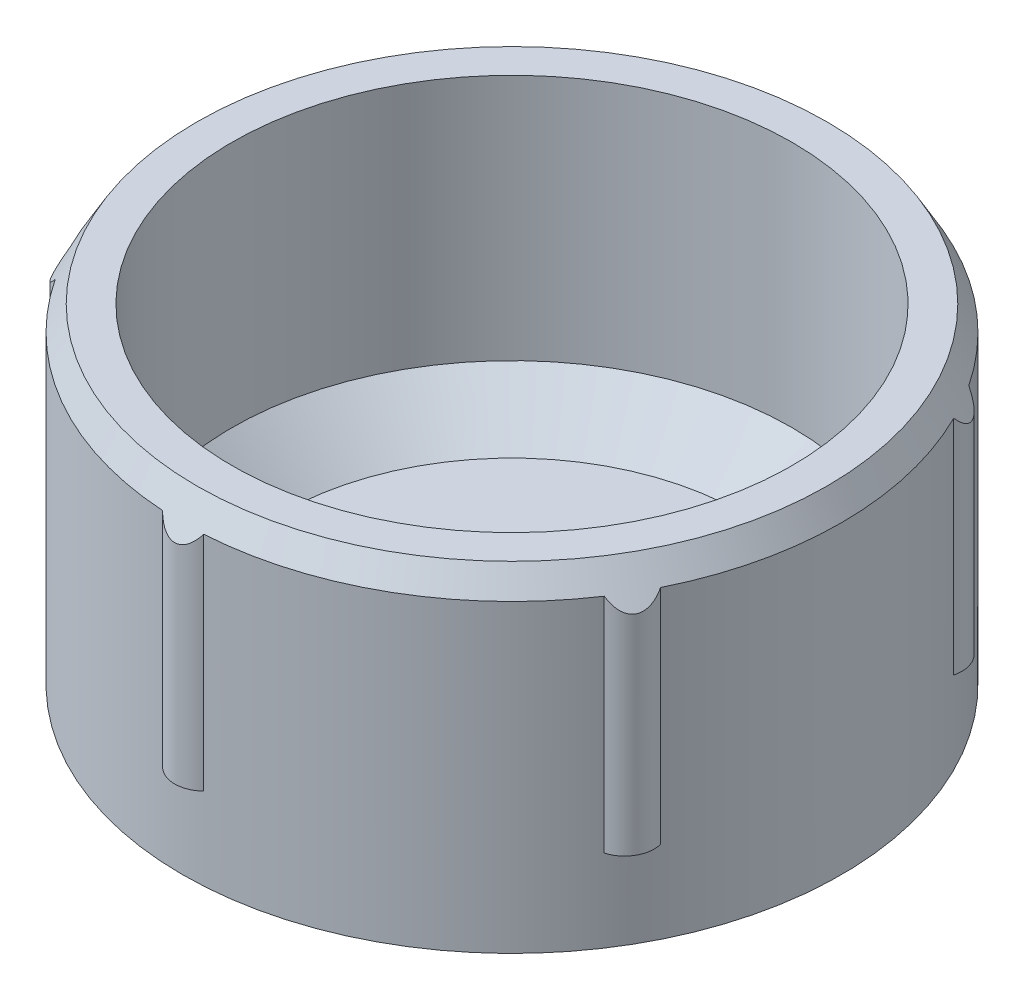
ISO-10303-21;
HEADER;
FILE_DESCRIPTION(('STEP AP214'),'2;1');
FILE_NAME('part.step','',(''),(''),'','','');
FILE_SCHEMA(('AUTOMOTIVE_DESIGN { 1 0 10303 214 1 1 1 1 }'));
ENDSEC;
DATA;
#1=APPLICATION_CONTEXT('core data for automotive mechanical design processes');
#2=APPLICATION_PROTOCOL_DEFINITION('international standard','automotive_design',2000,#1);
#3=PRODUCT_CONTEXT('',#1,'mechanical');
#4=PRODUCT('Part','Part','',(#3));
#5=PRODUCT_RELATED_PRODUCT_CATEGORY('part','',(#4));
#6=PRODUCT_DEFINITION_FORMATION('','',#4);
#7=PRODUCT_DEFINITION_CONTEXT('part definition',#1,'design');
#8=PRODUCT_DEFINITION('design','',#6,#7);
#9=PRODUCT_DEFINITION_SHAPE('','',#8);
#10=(LENGTH_UNIT() NAMED_UNIT(*) SI_UNIT(.MILLI.,.METRE.));
#11=(NAMED_UNIT(*) PLANE_ANGLE_UNIT() SI_UNIT($,.RADIAN.));
#12=(NAMED_UNIT(*) SI_UNIT($,.STERADIAN.) SOLID_ANGLE_UNIT());
#13=UNCERTAINTY_MEASURE_WITH_UNIT(LENGTH_MEASURE(1.E-05),#10,'distance_accuracy_value','');
#14=(GEOMETRIC_REPRESENTATION_CONTEXT(3) GLOBAL_UNCERTAINTY_ASSIGNED_CONTEXT((#13)) GLOBAL_UNIT_ASSIGNED_CONTEXT((#10,
#11,#12)) REPRESENTATION_CONTEXT('',''));
#15=CARTESIAN_POINT('',(0.,0.,0.));
#16=DIRECTION('',(0.,0.,1.));
#17=DIRECTION('',(1.,0.,0.));
#18=AXIS2_PLACEMENT_3D('',#15,#16,#17);
#19=CARTESIAN_POINT('',(-20.,20.,0.));
#20=DIRECTION('',(0.,-1.,0.));
#21=DIRECTION('',(0.,0.,-1.));
#22=AXIS2_PLACEMENT_3D('',#19,#20,#21);
#23=PLANE('',#22);
#24=CARTESIAN_POINT('',(0.,20.,0.));
#25=DIRECTION('',(0.,-1.,0.));
#26=DIRECTION('',(0.,0.,-1.));
#27=AXIS2_PLACEMENT_3D('',#24,#25,#26);
#28=CIRCLE('',#27,17.);
#29=CARTESIAN_POINT('',(0.,20.,-17.));
#30=VERTEX_POINT('',#29);
#31=EDGE_CURVE('E220',#30,#30,#28,.T.);
#32=ORIENTED_EDGE('',*,*,#31,.T.);
#33=EDGE_LOOP('',(#32));
#34=FACE_BOUND('',#33,.T.);
#35=CARTESIAN_POINT('',(0.,20.,0.));
#36=DIRECTION('',(0.,-1.,0.));
#37=DIRECTION('',(0.,0.,-1.));
#38=AXIS2_PLACEMENT_3D('',#35,#36,#37);
#39=CIRCLE('',#38,19.1339745962156);
#40=CARTESIAN_POINT('',(0.,20.,-19.1339745962156));
#41=VERTEX_POINT('',#40);
#42=EDGE_CURVE('E341',#41,#41,#39,.F.);
#43=ORIENTED_EDGE('',*,*,#42,.T.);
#44=EDGE_LOOP('',(#43));
#45=FACE_BOUND('',#44,.T.);
#46=ADVANCED_FACE('F45',(#34,#45),#23,.F.);
#47=CARTESIAN_POINT('',(0.,0.,0.));
#48=DIRECTION('',(0.,-1.,0.));
#49=DIRECTION('',(0.,0.,-1.));
#50=AXIS2_PLACEMENT_3D('',#47,#48,#49);
#51=CYLINDRICAL_SURFACE('',#50,17.);
#52=CARTESIAN_POINT('',(0.,5.00000000000002,0.));
#53=DIRECTION('',(0.,-1.,0.));
#54=DIRECTION('',(0.,0.,-1.));
#55=AXIS2_PLACEMENT_3D('',#52,#53,#54);
#56=CIRCLE('',#55,17.);
#57=CARTESIAN_POINT('',(0.,5.00000000000002,-17.));
#58=VERTEX_POINT('',#57);
#59=EDGE_CURVE('E54',#58,#58,#56,.T.);
#60=ORIENTED_EDGE('',*,*,#59,.T.);
#61=EDGE_LOOP('',(#60));
#62=FACE_BOUND('',#61,.T.);
#63=ORIENTED_EDGE('',*,*,#31,.F.);
#64=EDGE_LOOP('',(#63));
#65=FACE_BOUND('',#64,.T.);
#66=ADVANCED_FACE('F301',(#62,#65),#51,.F.);
#67=CARTESIAN_POINT('',(-17.,2.,0.));
#68=DIRECTION('',(0.,-1.,0.));
#69=DIRECTION('',(0.,0.,-1.));
#70=AXIS2_PLACEMENT_3D('',#67,#68,#69);
#71=PLANE('',#70);
#72=CARTESIAN_POINT('',(0.,2.,0.));
#73=DIRECTION('',(0.,-1.,0.));
#74=DIRECTION('',(0.,0.,-1.));
#75=AXIS2_PLACEMENT_3D('',#72,#73,#74);
#76=CIRCLE('',#75,14.);
#77=CARTESIAN_POINT('',(0.,2.,-14.));
#78=VERTEX_POINT('',#77);
#79=EDGE_CURVE('E12',#78,#78,#76,.F.);
#80=ORIENTED_EDGE('',*,*,#79,.T.);
#81=EDGE_LOOP('',(#80));
#82=FACE_BOUND('',#81,.T.);
#83=CARTESIAN_POINT('',(0.,2.,-9.5));
#84=DIRECTION('',(0.,1.,0.));
#85=DIRECTION('',(0.,0.,1.));
#86=AXIS2_PLACEMENT_3D('',#83,#84,#85);
#87=CIRCLE('',#86,1.7);
#88=CARTESIAN_POINT('',(0.,2.,-7.8));
#89=VERTEX_POINT('',#88);
#90=EDGE_CURVE('E338',#89,#89,#87,.T.);
#91=ORIENTED_EDGE('',*,*,#90,.F.);
#92=EDGE_LOOP('',(#91));
#93=FACE_BOUND('',#92,.T.);
#94=CARTESIAN_POINT('',(8.22724133595217,2.,4.75));
#95=DIRECTION('',(0.,1.,0.));
#96=DIRECTION('',(0.,0.,1.));
#97=AXIS2_PLACEMENT_3D('',#94,#95,#96);
#98=CIRCLE('',#97,1.7);
#99=CARTESIAN_POINT('',(8.22724133595217,2.,6.45));
#100=VERTEX_POINT('',#99);
#101=EDGE_CURVE('E335',#100,#100,#98,.T.);
#102=ORIENTED_EDGE('',*,*,#101,.F.);
#103=EDGE_LOOP('',(#102));
#104=FACE_BOUND('',#103,.T.);
#105=CARTESIAN_POINT('',(-8.22724133595217,2.,4.75));
#106=DIRECTION('',(0.,1.,0.));
#107=DIRECTION('',(0.,0.,1.));
#108=AXIS2_PLACEMENT_3D('',#105,#106,#107);
#109=CIRCLE('',#108,1.7);
#110=CARTESIAN_POINT('',(-8.22724133595217,2.,6.45));
#111=VERTEX_POINT('',#110);
#112=EDGE_CURVE('E330',#111,#111,#109,.T.);
#113=ORIENTED_EDGE('',*,*,#112,.F.);
#114=EDGE_LOOP('',(#113));
#115=FACE_BOUND('',#114,.T.);
#116=ADVANCED_FACE('F236',(#82,#93,#104,#115),#71,.F.);
#117=CARTESIAN_POINT('',(0.,16.7679491924311,0.));
#118=DIRECTION('',(0.,-1.,0.));
#119=DIRECTION('',(0.,0.,-1.));
#120=AXIS2_PLACEMENT_3D('',#117,#118,#119);
#121=CONICAL_SURFACE('',#120,21.,0.523598775598293);
#122=CARTESIAN_POINT('',(16.6614458574241,18.5002348111229,11.0630375226654));
#123=CARTESIAN_POINT('',(16.7001782902731,18.454769229216,11.0521555921859));
#124=CARTESIAN_POINT('',(16.7393539041802,18.4099928476587,11.0397672479723));
#125=CARTESIAN_POINT('',(16.8186275102973,18.3221202125627,11.0115132694681));
#126=CARTESIAN_POINT('',(16.8587281250766,18.2790300069745,10.9956362676855));
#127=CARTESIAN_POINT('',(16.9403083805225,18.1944350039381,10.9597082746973));
#128=CARTESIAN_POINT('',(16.9817998696506,18.1529688953181,10.9395917710724));
#129=CARTESIAN_POINT('',(17.0652394878581,18.0731452168106,10.894853543078));
#130=CARTESIAN_POINT('',(17.1071868862958,18.0347833239633,10.8702382451638));
#131=CARTESIAN_POINT('',(17.1974656232053,17.9566234286536,10.8118943802732));
#132=CARTESIAN_POINT('',(17.2458262537599,17.9174477506873,10.7773572290143));
#133=CARTESIAN_POINT('',(17.3416663210368,17.8462913000364,10.7008934434424));
#134=CARTESIAN_POINT('',(17.3891488324718,17.8142775544708,10.6590023277315));
#135=CARTESIAN_POINT('',(17.4742722412989,17.7640774609883,10.5749008046223));
#136=CARTESIAN_POINT('',(17.5122450385211,17.7444815847015,10.5338817569699));
#137=CARTESIAN_POINT('',(17.5854352327699,17.7132180100607,10.4466220683779));
#138=CARTESIAN_POINT('',(17.6206534186666,17.7015480344641,10.4003829317131));
#139=CARTESIAN_POINT('',(17.6871163115658,17.687193344434,10.3034241911654));
#140=CARTESIAN_POINT('',(17.7183390033882,17.6845565094118,10.2526821704549));
#141=CARTESIAN_POINT('',(17.7754006544998,17.6886882098856,10.1486208259367));
#142=CARTESIAN_POINT('',(17.801239019765,17.695457782509,10.0953012185562));
#143=CARTESIAN_POINT('',(17.8450096059357,17.7167450165492,9.99256973009802));
#144=CARTESIAN_POINT('',(17.8634277420316,17.7305537217444,9.9432117729305));
#145=CARTESIAN_POINT('',(17.8953549945965,17.7644293771837,9.84512407230255));
#146=CARTESIAN_POINT('',(17.9088648499678,17.784495384595,9.79639423534984));
#147=CARTESIAN_POINT('',(17.9373943623133,17.8419260028524,9.67456206443534));
#148=CARTESIAN_POINT('',(17.9493401542779,17.8827971995671,9.60239980736992));
#149=CARTESIAN_POINT('',(17.9644728385606,17.973312539132,9.46244287158882));
#150=CARTESIAN_POINT('',(17.9676064776809,18.0230080992201,9.39467715482793));
#151=CARTESIAN_POINT('',(17.9669560945629,18.1078779237976,9.2895988555075));
#152=CARTESIAN_POINT('',(17.965390110056,18.1411742332864,9.2507006143139));
#153=CARTESIAN_POINT('',(17.9599512546544,18.2096254343978,9.17470613252085));
#154=CARTESIAN_POINT('',(17.9560771798964,18.2447812872031,9.13761084324119));
#155=CARTESIAN_POINT('',(17.9463921152956,18.3160152245178,9.06576628192951));
#156=CARTESIAN_POINT('',(17.9406129394329,18.3520697205201,9.03098906499385));
#157=CARTESIAN_POINT('',(17.9273360024852,18.4253338561432,8.96312229184458));
#158=CARTESIAN_POINT('',(17.9198407409291,18.4625417483187,8.9300303658215));
#159=CARTESIAN_POINT('',(17.9115947905768,18.5002333299883,8.89771788443911));
#160=B_SPLINE_CURVE_WITH_KNOTS('',3,(#122,#123,#124,#125,#126,#127,#128,#129,#130,#131,#132,
#133,#134,#135,#136,#137,#138,#139,#140,#141,#142,#143,#144,#145,#146,#147,#148,#149,#150,#151,
#152,#153,#154,#155,#156,#157,#158,#159),.UNSPECIFIED.,.F.,.F.,(4,2,2,2,2,2,2,2,2,2,2,2,2,2,2,2,
2,2,4),(0.,0.182160826179334,0.364924250054394,0.550751600339854,0.736315545058584,
0.949241525994604,1.16116606185159,1.33815016579757,1.51508339773941,1.69295301062626,
1.87084223653647,2.03358172624303,2.19629670665743,2.44624938078674,2.69770934459204,
2.8512810410397,3.00493290827438,3.15613890465875,3.30712605058543),.UNSPECIFIED.);
#161=CARTESIAN_POINT('',(16.6616458574241,18.5,11.0629813939002));
#162=VERTEX_POINT('',#161);
#163=CARTESIAN_POINT('',(17.9116458574241,18.5,8.8979178844391));
#164=VERTEX_POINT('',#163);
#165=EDGE_CURVE('E273',#162,#164,#160,.T.);
#166=ORIENTED_EDGE('',*,*,#165,.T.);
#167=CARTESIAN_POINT('',(0.,18.5,0.));
#168=DIRECTION('',(0.,-1.,0.));
#169=DIRECTION('',(0.,0.,-1.));
#170=AXIS2_PLACEMENT_3D('',#167,#168,#169);
#171=CIRCLE('',#170,20.);
#172=CARTESIAN_POINT('',(17.9116458574242,18.5,-8.89791788443901));
#173=VERTEX_POINT('',#172);
#174=EDGE_CURVE('E337',#173,#164,#171,.T.);
#175=ORIENTED_EDGE('',*,*,#174,.F.);
#176=CARTESIAN_POINT('',(17.9115947905768,18.5002333299884,-8.89771788443898));
#177=CARTESIAN_POINT('',(17.9215369382315,18.4547678391037,-8.93670208056534));
#178=CARTESIAN_POINT('',(17.9303960857123,18.4099915479995,-8.97682328660478));
#179=CARTESIAN_POINT('',(17.9455641530924,18.3221190922524,-9.05960313945746));
#180=CARTESIAN_POINT('',(17.9518645397796,18.2790289755355,-9.10226974118383));
#181=CARTESIAN_POINT('',(17.9615400510436,18.1944341486869,-9.1908842018123));
#182=CARTESIAN_POINT('',(17.9648643645706,18.1529681273014,-9.23687507783729));
#183=CARTESIAN_POINT('',(17.9678396847745,18.0731446173148,-9.33150489346812));
#184=CARTESIAN_POINT('',(17.9674958915751,18.0347828057755,-9.38013998711683));
#185=CARTESIAN_POINT('',(17.9621079576199,17.9566230090261,-9.48749553437851));
#186=CARTESIAN_POINT('',(17.9563782011281,17.9174473551226,-9.54664565202623));
#187=CARTESIAN_POINT('',(17.9380786082124,17.8462909588691,-9.66787748955297));
#188=CARTESIAN_POINT('',(17.9255410691993,17.8142772435798,-9.7299441129099));
#189=CARTESIAN_POINT('',(17.8952686757006,17.7640772185813,-9.84571389650055));
#190=CARTESIAN_POINT('',(17.8787315208049,17.744481377586,-9.89910881101481));
#191=CARTESIAN_POINT('',(17.8397574823324,17.7132178725593,-10.0061231845051));
#192=CARTESIAN_POINT('',(17.8173222959234,17.7015479312941,-10.0597425745272));
#193=CARTESIAN_POINT('',(17.7665849917125,17.6871933060141,-10.1657804481601));
#194=CARTESIAN_POINT('',(17.7382524529301,17.6845565011998,-10.2181910744833));
#195=CARTESIAN_POINT('',(17.6766635063937,17.6886882539813,-10.3196385272597));
#196=CARTESIAN_POINT('',(17.6434065560341,17.6954578487292,-10.3686749810502));
#197=CARTESIAN_POINT('',(17.5763237660562,17.7167451202085,-10.4579471249911));
#198=CARTESIAN_POINT('',(17.542787581768,17.7305538444998,-10.4985766663178));
#199=CARTESIAN_POINT('',(17.4738047550894,17.7644295353627,-10.5752703053616));
#200=CARTESIAN_POINT('',(17.4383584011846,17.7844955590972,-10.6113350897368));
#201=CARTESIAN_POINT('',(17.3471133687854,17.8419262301731,-10.6969584495605));
#202=CARTESIAN_POINT('',(17.290591888578,17.8827974667128,-10.7433849367561));
#203=CARTESIAN_POINT('',(17.1769519148707,17.9733128871584,-10.8264686865918));
#204=CARTESIAN_POINT('',(17.1198318765786,18.0230084883751,-10.8630653495138));
#205=CARTESIAN_POINT('',(17.0285061114149,18.1078784329183,-10.9150412700724));
#206=CARTESIAN_POINT('',(16.9940361824178,18.1411748250251,-10.9331342299036));
#207=CARTESIAN_POINT('',(16.9255034619851,18.2096261968349,-10.9664213166428));
#208=CARTESIAN_POINT('',(16.8914408924877,18.2447821377294,-10.9816139252997));
#209=CARTESIAN_POINT('',(16.8243790115477,18.3160162523836,-11.0091487068337));
#210=CARTESIAN_POINT('',(16.7913714060362,18.352070837528,-11.0215324041037));
#211=CARTESIAN_POINT('',(16.7259584625717,18.4253351536821,-11.0439676224043));
#212=CARTESIAN_POINT('',(16.69355232206,18.4625431372344,-11.0540224930217));
#213=CARTESIAN_POINT('',(16.6614458574242,18.5002348111228,-11.0630375226654));
#214=B_SPLINE_CURVE_WITH_KNOTS('',3,(#176,#177,#178,#179,#180,#181,#182,#183,#184,#185,#186,
#187,#188,#189,#190,#191,#192,#193,#194,#195,#196,#197,#198,#199,#200,#201,#202,#203,#204,#205,
#206,#207,#208,#209,#210,#211,#212,#213),.UNSPECIFIED.,.F.,.F.,(4,2,2,2,2,2,2,2,2,2,2,2,2,2,2,2,
2,2,4),(0.,0.182160524739235,0.36492364450876,0.550750683730292,0.736314318658646,
0.949240282739379,1.16116480094071,1.33814883925254,1.51508200577265,1.69295154921639,
1.87084070615777,2.03358019995798,2.19629518434281,2.44624797234064,2.69770805272534,
2.8512800772718,3.00493227327748,3.15613858813752,3.30712605103992),.UNSPECIFIED.);
#215=CARTESIAN_POINT('',(16.6616458574242,18.5,-11.0629813939001));
#216=VERTEX_POINT('',#215);
#217=EDGE_CURVE('E266',#173,#216,#214,.T.);
#218=ORIENTED_EDGE('',*,*,#217,.T.);
#219=CARTESIAN_POINT('',(1.25,18.5,-19.9608992783391));
#220=VERTEX_POINT('',#219);
#221=EDGE_CURVE('E343',#220,#216,#171,.T.);
#222=ORIENTED_EDGE('',*,*,#221,.F.);
#223=CARTESIAN_POINT('',(1.34507792075579,18.6626642267774,-19.8605895145626));
#224=CARTESIAN_POINT('',(1.33027853426855,18.6352353622782,-19.8774642370637));
#225=CARTESIAN_POINT('',(1.31500725599319,18.6080061690719,-19.8942362186015));
#226=CARTESIAN_POINT('',(1.28340451521587,18.5538774667483,-19.927615908715));
#227=CARTESIAN_POINT('',(1.26706900537684,18.5269797418752,-19.9442226755753));
#228=CARTESIAN_POINT('',(1.19200942495374,18.4083380418107,-20.0175569758705));
#229=CARTESIAN_POINT('',(1.12751795452013,18.3192288886964,-20.0728646637481));
#230=CARTESIAN_POINT('',(0.983517024098527,18.150321550876,-20.1780699743248));
#231=CARTESIAN_POINT('',(0.904042137091805,18.0705026022988,-20.2279796433537));
#232=CARTESIAN_POINT('',(0.764745901448866,17.9567142448068,-20.2993320125398));
#233=CARTESIAN_POINT('',(0.7107633817028,17.9176014764809,-20.3239055825861));
#234=CARTESIAN_POINT('',(0.596654255344969,17.8464203083943,-20.3686890951268));
#235=CARTESIAN_POINT('',(0.536536168199431,17.8143423304353,-20.388904970179));
#236=CARTESIAN_POINT('',(0.421018076372237,17.7640849440087,-20.4206093298109));
#237=CARTESIAN_POINT('',(0.366491591178701,17.7444822909253,-20.432989506728));
#238=CARTESIAN_POINT('',(0.254324932728231,17.7132193547174,-20.4527438388516));
#239=CARTESIAN_POINT('',(0.196687540982936,17.7015520993581,-20.4601223885909));
#240=CARTESIAN_POINT('',(0.0795025849839504,17.6871956501368,-20.4692026808169));
#241=CARTESIAN_POINT('',(0.0199461433278847,17.6845570125144,-20.4708724566689));
#242=CARTESIAN_POINT('',(-0.0987073414366853,17.6886855494232,-20.4682606253861));
#243=CARTESIAN_POINT('',(-0.157804332315976,17.6954537780255,-20.4639783513041));
#244=CARTESIAN_POINT('',(-0.268644833279347,17.7167359601958,-20.4505222405503));
#245=CARTESIAN_POINT('',(-0.320585201839165,17.730538661487,-20.4417976308337));
#246=CARTESIAN_POINT('',(-0.42149735948814,17.7644084268064,-20.4204072924908));
#247=CARTESIAN_POINT('',(-0.470467910483586,17.7844780823292,-20.407739933476));
#248=CARTESIAN_POINT('',(-0.590389347522138,17.8419765255881,-20.3714883833622));
#249=CARTESIAN_POINT('',(-0.658977104303013,17.8829335075329,-20.3456986943396));
#250=CARTESIAN_POINT('',(-0.787708573989731,17.9734698023212,-20.2888125863862));
#251=CARTESIAN_POINT('',(-0.847831838855653,18.0230693684797,-20.2577037055653));
#252=CARTESIAN_POINT('',(-0.97218347798527,18.1394433164189,-20.1848898418315));
#253=CARTESIAN_POINT('',(-1.03457390254747,18.2076284619756,-20.1423373788771));
#254=CARTESIAN_POINT('',(-1.14949148271107,18.3499663731441,-20.0537932611772));
#255=CARTESIAN_POINT('',(-1.20199466577378,18.4241330357291,-20.0077936161527));
#256=CARTESIAN_POINT('',(-1.30411528665673,18.5855229380768,-19.9080364577936));
#257=CARTESIAN_POINT('',(-1.35265425743753,18.6732521384137,-19.8540054204845));
#258=CARTESIAN_POINT('',(-1.44058719723802,18.8522863693535,-19.7441799142003));
#259=CARTESIAN_POINT('',(-1.47996561788658,18.9435971765807,-19.6883826270402));
#260=CARTESIAN_POINT('',(-1.55011808943216,19.1272266057055,-19.5766346528821));
#261=CARTESIAN_POINT('',(-1.5810143113918,19.2195085653668,-19.5206993097619));
#262=CARTESIAN_POINT('',(-1.63567000614187,19.4054535268103,-19.4084584726615));
#263=CARTESIAN_POINT('',(-1.65945572755047,19.499110075889,-19.3521551442298));
#264=CARTESIAN_POINT('',(-1.68013914428985,19.5933194700031,-19.2957624881127));
#265=B_SPLINE_CURVE_WITH_KNOTS('',3,(#223,#224,#225,#226,#227,#228,#229,#230,#231,#232,#233,
#234,#235,#236,#237,#238,#239,#240,#241,#242,#243,#244,#245,#246,#247,#248,#249,#250,#251,#252,
#253,#254,#255,#256,#257,#258,#259,#260,#261,#262,#263,#264),.UNSPECIFIED.,.F.,.F.,(4,2,2,2,2,2,
2,2,2,2,2,2,2,2,2,2,2,2,2,2,4),(0.,0.106307515690647,0.213046039788342,0.581380872222424,
0.94887598031696,1.16144777734746,1.3737283257646,1.55076881053815,1.72765354156005,
1.90552714166168,2.08342067470621,2.24611399493321,2.40887468096892,2.65927643579346,
2.91027308202988,3.21455199656416,3.51955942364507,3.86069517402337,4.20240578322097,
4.53890011871915,4.87413648482067),.UNSPECIFIED.);
#266=CARTESIAN_POINT('',(-1.25,18.5,-19.9608992783391));
#267=VERTEX_POINT('',#266);
#268=EDGE_CURVE('E252',#220,#267,#265,.T.);
#269=ORIENTED_EDGE('',*,*,#268,.T.);
#270=CARTESIAN_POINT('',(-16.661645857424,18.5,-11.0629813939003));
#271=VERTEX_POINT('',#270);
#272=EDGE_CURVE('E61',#271,#267,#171,.T.);
#273=ORIENTED_EDGE('',*,*,#272,.F.);
#274=CARTESIAN_POINT('',(-16.661445857424,18.5002348111229,-11.0630375226655));
#275=CARTESIAN_POINT('',(-16.700178290273,18.454769229216,-11.052155592186));
#276=CARTESIAN_POINT('',(-16.7393539041801,18.4099928476588,-11.0397672479723));
#277=CARTESIAN_POINT('',(-16.8186275102973,18.3221202125628,-11.0115132694681));
#278=CARTESIAN_POINT('',(-16.8587281250765,18.2790300069745,-10.9956362676855));
#279=CARTESIAN_POINT('',(-16.9403083805225,18.1944350039381,-10.9597082746974));
#280=CARTESIAN_POINT('',(-16.9817998696506,18.1529688953181,-10.9395917710724));
#281=CARTESIAN_POINT('',(-17.065239487858,18.0731452168107,-10.894853543078));
#282=CARTESIAN_POINT('',(-17.1071868862957,18.0347833239633,-10.8702382451638));
#283=CARTESIAN_POINT('',(-17.1974656232053,17.9566234286536,-10.8118943802733));
#284=CARTESIAN_POINT('',(-17.2458262537598,17.9174477506873,-10.7773572290143));
#285=CARTESIAN_POINT('',(-17.3416663210368,17.8462913000364,-10.7008934434424));
#286=CARTESIAN_POINT('',(-17.3891488324718,17.8142775544708,-10.6590023277315));
#287=CARTESIAN_POINT('',(-17.4742722412988,17.7640774609883,-10.5749008046223));
#288=CARTESIAN_POINT('',(-17.512245038521,17.7444815847015,-10.5338817569699));
#289=CARTESIAN_POINT('',(-17.5854352327699,17.7132180100607,-10.4466220683779));
#290=CARTESIAN_POINT('',(-17.6206534186666,17.7015480344641,-10.4003829317132));
#291=CARTESIAN_POINT('',(-17.6871163115658,17.687193344434,-10.3034241911654));
#292=CARTESIAN_POINT('',(-17.7183390033882,17.6845565094118,-10.2526821704549));
#293=CARTESIAN_POINT('',(-17.7754006544998,17.6886882098856,-10.1486208259367));
#294=CARTESIAN_POINT('',(-17.801239019765,17.695457782509,-10.0953012185562));
#295=CARTESIAN_POINT('',(-17.8450096059357,17.7167450165492,-9.99256973009804));
#296=CARTESIAN_POINT('',(-17.8634277420316,17.7305537217444,-9.94321177293052));
#297=CARTESIAN_POINT('',(-17.8953549945964,17.7644293771837,-9.84512407230257));
#298=CARTESIAN_POINT('',(-17.9088648499678,17.784495384595,-9.79639423534987));
#299=CARTESIAN_POINT('',(-17.9373943623133,17.8419260028524,-9.67456206443536));
#300=CARTESIAN_POINT('',(-17.9493401542779,17.8827971995671,-9.60239980736995));
#301=CARTESIAN_POINT('',(-17.9644728385606,17.973312539132,-9.46244287158885));
#302=CARTESIAN_POINT('',(-17.9676064776809,18.0230080992201,-9.39467715482796));
#303=CARTESIAN_POINT('',(-17.9669560945629,18.1078779237976,-9.28959885550754));
#304=CARTESIAN_POINT('',(-17.965390110056,18.1411742332864,-9.25070061431395));
#305=CARTESIAN_POINT('',(-17.9599512546544,18.2096254343978,-9.17470613252091));
#306=CARTESIAN_POINT('',(-17.9560771798964,18.244781287203,-9.13761084324125));
#307=CARTESIAN_POINT('',(-17.9463921152956,18.3160152245177,-9.06576628192959));
#308=CARTESIAN_POINT('',(-17.9406129394329,18.35206972052,-9.03098906499394));
#309=CARTESIAN_POINT('',(-17.9273360024853,18.4253338561431,-8.96312229184469));
#310=CARTESIAN_POINT('',(-17.9198407409292,18.4625417483186,-8.93003036582161));
#311=CARTESIAN_POINT('',(-17.9115947905768,18.5002333299881,-8.89771788443922));
#312=B_SPLINE_CURVE_WITH_KNOTS('',3,(#274,#275,#276,#277,#278,#279,#280,#281,#282,#283,#284,
#285,#286,#287,#288,#289,#290,#291,#292,#293,#294,#295,#296,#297,#298,#299,#300,#301,#302,#303,
#304,#305,#306,#307,#308,#309,#310,#311),.UNSPECIFIED.,.F.,.F.,(4,2,2,2,2,2,2,2,2,2,2,2,2,2,2,2,
2,2,4),(0.,0.182160826179351,0.364924250054422,0.550751600339904,0.736315545058647,
0.949241525994666,1.16116606185166,1.33815016579763,1.51508339773949,1.69295301062634,
1.87084223653656,2.03358172624312,2.19629670665752,2.44624938078682,2.69770934459211,
2.85128104103975,3.00493290827438,3.15613890465873,3.30712605058537),.UNSPECIFIED.);
#313=CARTESIAN_POINT('',(-17.9116458574242,18.4999999999999,-8.89791788443909));
#314=VERTEX_POINT('',#313);
#315=EDGE_CURVE('E133',#271,#314,#312,.T.);
#316=ORIENTED_EDGE('',*,*,#315,.T.);
#317=CARTESIAN_POINT('',(-17.9116458574242,18.5,8.89791788443886));
#318=VERTEX_POINT('',#317);
#319=EDGE_CURVE('E136',#318,#314,#171,.T.);
#320=ORIENTED_EDGE('',*,*,#319,.F.);
#321=CARTESIAN_POINT('',(-17.9115947905767,18.5002333299886,8.89771788443886));
#322=CARTESIAN_POINT('',(-17.9215369382315,18.4547678391039,8.93670208056523));
#323=CARTESIAN_POINT('',(-17.9303960857123,18.4099915479997,8.97682328660468));
#324=CARTESIAN_POINT('',(-17.9455641530924,18.3221190922525,9.05960313945736));
#325=CARTESIAN_POINT('',(-17.9518645397796,18.2790289755356,9.10226974118373));
#326=CARTESIAN_POINT('',(-17.9615400510436,18.194434148687,9.19088420181222));
#327=CARTESIAN_POINT('',(-17.9648643645706,18.1529681273015,9.23687507783721));
#328=CARTESIAN_POINT('',(-17.9678396847745,18.0731446173149,9.33150489346805));
#329=CARTESIAN_POINT('',(-17.9674958915751,18.0347828057755,9.38013998711677));
#330=CARTESIAN_POINT('',(-17.9621079576199,17.9566230090262,9.48749553437845));
#331=CARTESIAN_POINT('',(-17.9563782011281,17.9174473551226,9.54664565202618));
#332=CARTESIAN_POINT('',(-17.9380786082124,17.8462909588691,9.66787748955291));
#333=CARTESIAN_POINT('',(-17.9255410691993,17.8142772435798,9.72994411290984));
#334=CARTESIAN_POINT('',(-17.8952686757006,17.7640772185814,9.8457138965005));
#335=CARTESIAN_POINT('',(-17.8787315208049,17.744481377586,9.89910881101477));
#336=CARTESIAN_POINT('',(-17.8397574823325,17.7132178725593,10.006123184505));
#337=CARTESIAN_POINT('',(-17.8173222959234,17.7015479312941,10.0597425745271));
#338=CARTESIAN_POINT('',(-17.7665849917125,17.6871933060141,10.1657804481601));
#339=CARTESIAN_POINT('',(-17.7382524529301,17.6845565011998,10.2181910744832));
#340=CARTESIAN_POINT('',(-17.6766635063937,17.6886882539813,10.3196385272597));
#341=CARTESIAN_POINT('',(-17.6434065560341,17.6954578487291,10.3686749810502));
#342=CARTESIAN_POINT('',(-17.5763237660563,17.7167451202085,10.457947124991));
#343=CARTESIAN_POINT('',(-17.542787581768,17.7305538444998,10.4985766663178));
#344=CARTESIAN_POINT('',(-17.4738047550894,17.7644295353627,10.5752703053616));
#345=CARTESIAN_POINT('',(-17.4383584011846,17.7844955590971,10.6113350897368));
#346=CARTESIAN_POINT('',(-17.3471133687854,17.841926230173,10.6969584495604));
#347=CARTESIAN_POINT('',(-17.290591888578,17.8827974667128,10.7433849367561));
#348=CARTESIAN_POINT('',(-17.1769519148708,17.9733128871583,10.8264686865918));
#349=CARTESIAN_POINT('',(-17.1198318765787,18.0230084883751,10.8630653495138));
#350=CARTESIAN_POINT('',(-17.0285061114149,18.1078784329183,10.9150412700724));
#351=CARTESIAN_POINT('',(-16.9940361824178,18.141174825025,10.9331342299036));
#352=CARTESIAN_POINT('',(-16.9255034619852,18.2096261968349,10.9664213166428));
#353=CARTESIAN_POINT('',(-16.8914408924878,18.2447821377294,10.9816139252997));
#354=CARTESIAN_POINT('',(-16.8243790115477,18.3160162523835,11.0091487068337));
#355=CARTESIAN_POINT('',(-16.7913714060363,18.3520708375279,11.0215324041037));
#356=CARTESIAN_POINT('',(-16.7259584625718,18.425335153682,11.0439676224043));
#357=CARTESIAN_POINT('',(-16.6935523220601,18.4625431372343,11.0540224930216));
#358=CARTESIAN_POINT('',(-16.6614458574243,18.5002348111227,11.0630375226654));
#359=B_SPLINE_CURVE_WITH_KNOTS('',3,(#321,#322,#323,#324,#325,#326,#327,#328,#329,#330,#331,
#332,#333,#334,#335,#336,#337,#338,#339,#340,#341,#342,#343,#344,#345,#346,#347,#348,#349,#350,
#351,#352,#353,#354,#355,#356,#357,#358),.UNSPECIFIED.,.F.,.F.,(4,2,2,2,2,2,2,2,2,2,2,2,2,2,2,2,
2,2,4),(0.,0.182160524739267,0.36492364450882,0.550750683730383,0.736314318658768,
0.949240282739503,1.16116480094084,1.33814883925267,1.5150820057728,1.69295154921654,
1.87084070615793,2.03358019995813,2.19629518434296,2.44624797234078,2.69770805272548,
2.85128007727191,3.00493227327758,3.1561385881376,3.30712605103999),.UNSPECIFIED.);
#360=CARTESIAN_POINT('',(-16.6616458574242,18.4999999999999,11.0629813939001));
#361=VERTEX_POINT('',#360);
#362=EDGE_CURVE('E148',#318,#361,#359,.T.);
#363=ORIENTED_EDGE('',*,*,#362,.T.);
#364=CARTESIAN_POINT('',(-1.25000000000013,18.5,19.9608992783391));
#365=VERTEX_POINT('',#364);
#366=EDGE_CURVE('E150',#365,#361,#171,.T.);
#367=ORIENTED_EDGE('',*,*,#366,.F.);
#368=CARTESIAN_POINT('',(-1.34507792075579,18.6626642267774,19.8605895145626));
#369=CARTESIAN_POINT('',(-1.33027853426855,18.6352353622783,19.8774642370637));
#370=CARTESIAN_POINT('',(-1.31500725599319,18.6080061690719,19.8942362186015));
#371=CARTESIAN_POINT('',(-1.28340451521587,18.5538774667483,19.927615908715));
#372=CARTESIAN_POINT('',(-1.26706900537684,18.5269797418752,19.9442226755753));
#373=CARTESIAN_POINT('',(-1.19200942495375,18.4083380418107,20.0175569758705));
#374=CARTESIAN_POINT('',(-1.12751795452013,18.3192288886964,20.0728646637481));
#375=CARTESIAN_POINT('',(-0.983517024098523,18.150321550876,20.1780699743248));
#376=CARTESIAN_POINT('',(-0.904042137091803,18.0705026022988,20.2279796433537));
#377=CARTESIAN_POINT('',(-0.764745901448865,17.9567142448068,20.2993320125398));
#378=CARTESIAN_POINT('',(-0.710763381702798,17.9176014764809,20.3239055825861));
#379=CARTESIAN_POINT('',(-0.596654255344969,17.8464203083943,20.3686890951268));
#380=CARTESIAN_POINT('',(-0.536536168199431,17.8143423304353,20.388904970179));
#381=CARTESIAN_POINT('',(-0.421018076372238,17.7640849440087,20.4206093298109));
#382=CARTESIAN_POINT('',(-0.366491591178701,17.7444822909253,20.432989506728));
#383=CARTESIAN_POINT('',(-0.254324932728232,17.7132193547174,20.4527438388516));
#384=CARTESIAN_POINT('',(-0.196687540982936,17.7015520993581,20.4601223885909));
#385=CARTESIAN_POINT('',(-0.0795025849839506,17.6871956501368,20.4692026808169));
#386=CARTESIAN_POINT('',(-0.0199461433278844,17.6845570125144,20.4708724566689));
#387=CARTESIAN_POINT('',(0.0987073414366863,17.6886855494232,20.4682606253861));
#388=CARTESIAN_POINT('',(0.157804332315977,17.6954537780255,20.4639783513041));
#389=CARTESIAN_POINT('',(0.268644833279349,17.7167359601958,20.4505222405503));
#390=CARTESIAN_POINT('',(0.320585201839167,17.730538661487,20.4417976308337));
#391=CARTESIAN_POINT('',(0.421497359488142,17.7644084268064,20.4204072924908));
#392=CARTESIAN_POINT('',(0.470467910483588,17.7844780823292,20.407739933476));
#393=CARTESIAN_POINT('',(0.59038934752214,17.8419765255881,20.3714883833622));
#394=CARTESIAN_POINT('',(0.658977104303015,17.8829335075329,20.3456986943396));
#395=CARTESIAN_POINT('',(0.787708573989733,17.9734698023212,20.2888125863862));
#396=CARTESIAN_POINT('',(0.847831838855654,18.0230693684797,20.2577037055653));
#397=CARTESIAN_POINT('',(0.972183477985241,18.1394433164189,20.1848898418315));
#398=CARTESIAN_POINT('',(1.03457390254741,18.2076284619756,20.1423373788772));
#399=CARTESIAN_POINT('',(1.14949148271097,18.349966373144,20.0537932611772));
#400=CARTESIAN_POINT('',(1.20199466577366,18.4241330357289,20.0077936161528));
#401=CARTESIAN_POINT('',(1.30411528665661,18.5855229380766,19.9080364577938));
#402=CARTESIAN_POINT('',(1.35265425743743,18.6732521384135,19.8540054204846));
#403=CARTESIAN_POINT('',(1.44058719723795,18.8522863693533,19.7441799142004));
#404=CARTESIAN_POINT('',(1.47996561788653,18.9435971765806,19.6883826270403));
#405=CARTESIAN_POINT('',(1.55011808943213,19.1272266057054,19.5766346528822));
#406=CARTESIAN_POINT('',(1.58101431139178,19.2195085653667,19.5206993097619));
#407=CARTESIAN_POINT('',(1.63567000614186,19.4054535268103,19.4084584726616));
#408=CARTESIAN_POINT('',(1.65945572755046,19.499110075889,19.3521551442298));
#409=CARTESIAN_POINT('',(1.68013914428985,19.5933194700031,19.2957624881127));
#410=B_SPLINE_CURVE_WITH_KNOTS('',3,(#368,#369,#370,#371,#372,#373,#374,#375,#376,#377,#378,
#379,#380,#381,#382,#383,#384,#385,#386,#387,#388,#389,#390,#391,#392,#393,#394,#395,#396,#397,
#398,#399,#400,#401,#402,#403,#404,#405,#406,#407,#408,#409),.UNSPECIFIED.,.F.,.F.,(4,2,2,2,2,2,
2,2,2,2,2,2,2,2,2,2,2,2,2,2,4),(0.,0.106307515690642,0.213046039788339,0.581380872222419,
0.948875980316959,1.16144777734746,1.37372832576459,1.55076881053815,1.72765354156004,
1.90552714166168,2.08342067470621,2.24611399493321,2.40887468096892,2.65927643579346,
2.91027308202988,3.21455199656402,3.51955942364478,3.86069517402315,4.20240578322083,
4.53890011871908,4.87413648482067),.UNSPECIFIED.);
#411=CARTESIAN_POINT('',(1.24999999999997,18.4999999999999,19.9608992783392));
#412=VERTEX_POINT('',#411);
#413=EDGE_CURVE('E259',#365,#412,#410,.T.);
#414=ORIENTED_EDGE('',*,*,#413,.T.);
#415=EDGE_CURVE('E272',#162,#412,#171,.T.);
#416=ORIENTED_EDGE('',*,*,#415,.F.);
#417=EDGE_LOOP('',(#166,#175,#218,#222,#269,#273,#316,#320,#363,#367,#414,#416));
#418=FACE_BOUND('',#417,.T.);
#419=ORIENTED_EDGE('',*,*,#42,.F.);
#420=EDGE_LOOP('',(#419));
#421=FACE_BOUND('',#420,.T.);
#422=ADVANCED_FACE('F134',(#418,#421),#121,.T.);
#423=CARTESIAN_POINT('',(0.,0.,0.));
#424=DIRECTION('',(0.,1.,0.));
#425=DIRECTION('',(0.,0.,1.));
#426=AXIS2_PLACEMENT_3D('',#423,#424,#425);
#427=PLANE('',#426);
#428=CARTESIAN_POINT('',(0.,0.,-9.5));
#429=DIRECTION('',(0.,1.,0.));
#430=DIRECTION('',(0.,0.,1.));
#431=AXIS2_PLACEMENT_3D('',#428,#429,#430);
#432=CIRCLE('',#431,1.7);
#433=CARTESIAN_POINT('',(0.,0.,-7.8));
#434=VERTEX_POINT('',#433);
#435=EDGE_CURVE('E319',#434,#434,#432,.F.);
#436=ORIENTED_EDGE('',*,*,#435,.F.);
#437=EDGE_LOOP('',(#436));
#438=FACE_BOUND('',#437,.T.);
#439=CARTESIAN_POINT('',(8.22724133595217,0.,4.75));
#440=DIRECTION('',(0.,1.,0.));
#441=DIRECTION('',(0.,0.,1.));
#442=AXIS2_PLACEMENT_3D('',#439,#440,#441);
#443=CIRCLE('',#442,1.7);
#444=CARTESIAN_POINT('',(8.22724133595217,0.,6.45));
#445=VERTEX_POINT('',#444);
#446=EDGE_CURVE('E323',#445,#445,#443,.F.);
#447=ORIENTED_EDGE('',*,*,#446,.F.);
#448=EDGE_LOOP('',(#447));
#449=FACE_BOUND('',#448,.T.);
#450=CARTESIAN_POINT('',(-8.22724133595217,0.,4.75));
#451=DIRECTION('',(0.,1.,0.));
#452=DIRECTION('',(0.,0.,1.));
#453=AXIS2_PLACEMENT_3D('',#450,#451,#452);
#454=CIRCLE('',#453,1.7);
#455=CARTESIAN_POINT('',(-8.22724133595217,0.,6.45));
#456=VERTEX_POINT('',#455);
#457=EDGE_CURVE('E327',#456,#456,#454,.F.);
#458=ORIENTED_EDGE('',*,*,#457,.F.);
#459=EDGE_LOOP('',(#458));
#460=FACE_BOUND('',#459,.T.);
#461=CARTESIAN_POINT('',(0.,0.,0.));
#462=DIRECTION('',(0.,-1.,0.));
#463=DIRECTION('',(0.,0.,-1.));
#464=AXIS2_PLACEMENT_3D('',#461,#462,#463);
#465=CIRCLE('',#464,20.);
#466=CARTESIAN_POINT('',(0.,0.,-20.));
#467=VERTEX_POINT('',#466);
#468=EDGE_CURVE('E141',#467,#467,#465,.T.);
#469=ORIENTED_EDGE('',*,*,#468,.T.);
#470=EDGE_LOOP('',(#469));
#471=FACE_BOUND('',#470,.T.);
#472=ADVANCED_FACE('F235',(#438,#449,#460,#471),#427,.F.);
#473=CARTESIAN_POINT('',(0.,5.,0.));
#474=DIRECTION('',(0.,1.,0.));
#475=DIRECTION('',(0.,0.,1.));
#476=AXIS2_PLACEMENT_3D('',#473,#474,#475);
#477=PLANE('',#476);
#478=CARTESIAN_POINT('',(0.,5.,0.));
#479=DIRECTION('',(0.,1.,0.));
#480=DIRECTION('',(0.,0.,1.));
#481=AXIS2_PLACEMENT_3D('',#478,#479,#480);
#482=CIRCLE('',#481,20.);
#483=CARTESIAN_POINT('',(1.25,5.,-19.9608992783391));
#484=VERTEX_POINT('',#483);
#485=CARTESIAN_POINT('',(-1.25,5.,-19.9608992783391));
#486=VERTEX_POINT('',#485);
#487=EDGE_CURVE('E210',#484,#486,#482,.T.);
#488=ORIENTED_EDGE('',*,*,#487,.T.);
#489=CARTESIAN_POINT('',(0.,5.,-18.6808810032201));
#490=DIRECTION('',(0.,1.,0.));
#491=DIRECTION('',(0.,0.,1.));
#492=AXIS2_PLACEMENT_3D('',#489,#490,#491);
#493=CIRCLE('',#492,1.78911899677994);
#494=EDGE_CURVE('E213',#486,#484,#493,.F.);
#495=ORIENTED_EDGE('',*,*,#494,.T.);
#496=EDGE_LOOP('',(#488,#495));
#497=FACE_BOUND('',#496,.T.);
#498=ADVANCED_FACE('F291',(#497),#477,.F.);
#499=CARTESIAN_POINT('',(0.,5.,0.));
#500=DIRECTION('',(0.,1.,0.));
#501=DIRECTION('',(0.,0.,1.));
#502=AXIS2_PLACEMENT_3D('',#499,#500,#501);
#503=PLANE('',#502);
#504=CARTESIAN_POINT('',(16.1781175138627,5.,-9.34044050161003));
#505=DIRECTION('',(0.,1.,0.));
#506=DIRECTION('',(0.,0.,1.));
#507=AXIS2_PLACEMENT_3D('',#504,#505,#506);
#508=CIRCLE('',#507,1.78911899677994);
#509=CARTESIAN_POINT('',(16.6616458574242,5.,-11.0629813939001));
#510=VERTEX_POINT('',#509);
#511=CARTESIAN_POINT('',(17.9116458574242,5.,-8.89791788443903));
#512=VERTEX_POINT('',#511);
#513=EDGE_CURVE('E200',#510,#512,#508,.F.);
#514=ORIENTED_EDGE('',*,*,#513,.T.);
#515=CARTESIAN_POINT('',(0.,5.,0.));
#516=DIRECTION('',(0.,1.,0.));
#517=DIRECTION('',(0.,0.,1.));
#518=AXIS2_PLACEMENT_3D('',#515,#516,#517);
#519=CIRCLE('',#518,20.);
#520=EDGE_CURVE('E192',#512,#510,#519,.T.);
#521=ORIENTED_EDGE('',*,*,#520,.T.);
#522=EDGE_LOOP('',(#514,#521));
#523=FACE_BOUND('',#522,.T.);
#524=ADVANCED_FACE('F288',(#523),#503,.F.);
#525=CARTESIAN_POINT('',(0.,5.,0.));
#526=DIRECTION('',(0.,1.,0.));
#527=DIRECTION('',(0.,0.,1.));
#528=AXIS2_PLACEMENT_3D('',#525,#526,#527);
#529=PLANE('',#528);
#530=CARTESIAN_POINT('',(16.1781175138627,5.,9.34044050161002));
#531=DIRECTION('',(0.,1.,0.));
#532=DIRECTION('',(0.,0.,1.));
#533=AXIS2_PLACEMENT_3D('',#530,#531,#532);
#534=CIRCLE('',#533,1.78911899677994);
#535=CARTESIAN_POINT('',(17.9116458574242,5.,8.89791788443902));
#536=VERTEX_POINT('',#535);
#537=CARTESIAN_POINT('',(16.6616458574242,5.,11.0629813939001));
#538=VERTEX_POINT('',#537);
#539=EDGE_CURVE('E188',#536,#538,#534,.F.);
#540=ORIENTED_EDGE('',*,*,#539,.T.);
#541=CARTESIAN_POINT('',(0.,5.,0.));
#542=DIRECTION('',(0.,1.,0.));
#543=DIRECTION('',(0.,0.,1.));
#544=AXIS2_PLACEMENT_3D('',#541,#542,#543);
#545=CIRCLE('',#544,20.);
#546=EDGE_CURVE('E180',#538,#536,#545,.T.);
#547=ORIENTED_EDGE('',*,*,#546,.T.);
#548=EDGE_LOOP('',(#540,#547));
#549=FACE_BOUND('',#548,.T.);
#550=ADVANCED_FACE('F287',(#549),#529,.F.);
#551=CARTESIAN_POINT('',(0.,5.,0.));
#552=DIRECTION('',(0.,1.,0.));
#553=DIRECTION('',(0.,0.,1.));
#554=AXIS2_PLACEMENT_3D('',#551,#552,#553);
#555=PLANE('',#554);
#556=CARTESIAN_POINT('',(0.,5.,18.6808810032201));
#557=DIRECTION('',(0.,1.,0.));
#558=DIRECTION('',(0.,0.,1.));
#559=AXIS2_PLACEMENT_3D('',#556,#557,#558);
#560=CIRCLE('',#559,1.78911899677994);
#561=CARTESIAN_POINT('',(1.25,5.,19.9608992783391));
#562=VERTEX_POINT('',#561);
#563=CARTESIAN_POINT('',(-1.24999999999999,5.,19.9608992783391));
#564=VERTEX_POINT('',#563);
#565=EDGE_CURVE('E176',#562,#564,#560,.F.);
#566=ORIENTED_EDGE('',*,*,#565,.T.);
#567=CARTESIAN_POINT('',(0.,5.,0.));
#568=DIRECTION('',(0.,1.,0.));
#569=DIRECTION('',(0.,0.,1.));
#570=AXIS2_PLACEMENT_3D('',#567,#568,#569);
#571=CIRCLE('',#570,20.);
#572=EDGE_CURVE('E170',#564,#562,#571,.T.);
#573=ORIENTED_EDGE('',*,*,#572,.T.);
#574=EDGE_LOOP('',(#566,#573));
#575=FACE_BOUND('',#574,.T.);
#576=ADVANCED_FACE('F355',(#575),#555,.F.);
#577=CARTESIAN_POINT('',(0.,5.,0.));
#578=DIRECTION('',(0.,1.,0.));
#579=DIRECTION('',(0.,0.,1.));
#580=AXIS2_PLACEMENT_3D('',#577,#578,#579);
#581=PLANE('',#580);
#582=CARTESIAN_POINT('',(-16.1781175138627,5.,9.34044050161003));
#583=DIRECTION('',(0.,1.,0.));
#584=DIRECTION('',(0.,0.,1.));
#585=AXIS2_PLACEMENT_3D('',#582,#583,#584);
#586=CIRCLE('',#585,1.78911899677994);
#587=CARTESIAN_POINT('',(-16.6616458574242,5.,11.0629813939001));
#588=VERTEX_POINT('',#587);
#589=CARTESIAN_POINT('',(-17.9116458574242,5.,8.89791788443904));
#590=VERTEX_POINT('',#589);
#591=EDGE_CURVE('E159',#588,#590,#586,.F.);
#592=ORIENTED_EDGE('',*,*,#591,.T.);
#593=CARTESIAN_POINT('',(0.,5.,0.));
#594=DIRECTION('',(0.,1.,0.));
#595=DIRECTION('',(0.,0.,1.));
#596=AXIS2_PLACEMENT_3D('',#593,#594,#595);
#597=CIRCLE('',#596,20.);
#598=EDGE_CURVE('E155',#590,#588,#597,.T.);
#599=ORIENTED_EDGE('',*,*,#598,.T.);
#600=EDGE_LOOP('',(#592,#599));
#601=FACE_BOUND('',#600,.T.);
#602=ADVANCED_FACE('F352',(#601),#581,.F.);
#603=CARTESIAN_POINT('',(0.,5.,0.));
#604=DIRECTION('',(0.,1.,0.));
#605=DIRECTION('',(0.,0.,1.));
#606=AXIS2_PLACEMENT_3D('',#603,#604,#605);
#607=PLANE('',#606);
#608=CARTESIAN_POINT('',(-16.1781175138627,5.,-9.34044050161003));
#609=DIRECTION('',(0.,1.,0.));
#610=DIRECTION('',(0.,0.,1.));
#611=AXIS2_PLACEMENT_3D('',#608,#609,#610);
#612=CIRCLE('',#611,1.78911899677994);
#613=CARTESIAN_POINT('',(-17.9116458574242,5.,-8.89791788443903));
#614=VERTEX_POINT('',#613);
#615=CARTESIAN_POINT('',(-16.6616458574242,5.,-11.0629813939001));
#616=VERTEX_POINT('',#615);
#617=EDGE_CURVE('E154',#614,#616,#612,.F.);
#618=ORIENTED_EDGE('',*,*,#617,.T.);
#619=CARTESIAN_POINT('',(0.,5.,0.));
#620=DIRECTION('',(0.,1.,0.));
#621=DIRECTION('',(0.,0.,1.));
#622=AXIS2_PLACEMENT_3D('',#619,#620,#621);
#623=CIRCLE('',#622,20.);
#624=EDGE_CURVE('E163',#616,#614,#623,.T.);
#625=ORIENTED_EDGE('',*,*,#624,.T.);
#626=EDGE_LOOP('',(#618,#625));
#627=FACE_BOUND('',#626,.T.);
#628=ADVANCED_FACE('F354',(#627),#607,.F.);
#629=CARTESIAN_POINT('',(-16.1781175138627,-2.5513101624059,-9.34044050161003));
#630=DIRECTION('',(0.,1.,0.));
#631=DIRECTION('',(0.,0.,1.));
#632=AXIS2_PLACEMENT_3D('',#629,#630,#631);
#633=CYLINDRICAL_SURFACE('',#632,1.78911899677994);
#634=ORIENTED_EDGE('',*,*,#315,.F.);
#635=DIRECTION('',(0.,1.,0.));
#636=VECTOR('',#635,1.);
#637=CARTESIAN_POINT('',(-16.661645857424,-2.5513101624059,-11.0629813939003));
#638=LINE('',#637,#636);
#639=EDGE_CURVE('E156',#616,#271,#638,.T.);
#640=ORIENTED_EDGE('',*,*,#639,.F.);
#641=ORIENTED_EDGE('',*,*,#617,.F.);
#642=DIRECTION('',(0.,1.,0.));
#643=VECTOR('',#642,1.);
#644=CARTESIAN_POINT('',(-17.9116458574241,-2.5513101624059,-8.89791788443922));
#645=LINE('',#644,#643);
#646=EDGE_CURVE('E69',#614,#314,#645,.T.);
#647=ORIENTED_EDGE('',*,*,#646,.T.);
#648=EDGE_LOOP('',(#634,#640,#641,#647));
#649=FACE_BOUND('',#648,.T.);
#650=ADVANCED_FACE('F152',(#649),#633,.T.);
#651=CARTESIAN_POINT('',(-16.1781175138627,-2.5513101624059,9.34044050161003));
#652=DIRECTION('',(0.,1.,0.));
#653=DIRECTION('',(0.,0.,1.));
#654=AXIS2_PLACEMENT_3D('',#651,#652,#653);
#655=CYLINDRICAL_SURFACE('',#654,1.78911899677994);
#656=ORIENTED_EDGE('',*,*,#362,.F.);
#657=DIRECTION('',(0.,1.,0.));
#658=VECTOR('',#657,1.);
#659=CARTESIAN_POINT('',(-17.9116458574242,-2.5513101624059,8.89791788443886));
#660=LINE('',#659,#658);
#661=EDGE_CURVE('E147',#590,#318,#660,.T.);
#662=ORIENTED_EDGE('',*,*,#661,.F.);
#663=ORIENTED_EDGE('',*,*,#591,.F.);
#664=DIRECTION('',(0.,1.,0.));
#665=VECTOR('',#664,1.);
#666=CARTESIAN_POINT('',(-16.6616458574243,-2.5513101624059,11.0629813939));
#667=LINE('',#666,#665);
#668=EDGE_CURVE('E167',#588,#361,#667,.T.);
#669=ORIENTED_EDGE('',*,*,#668,.T.);
#670=EDGE_LOOP('',(#656,#662,#663,#669));
#671=FACE_BOUND('',#670,.T.);
#672=ADVANCED_FACE('F349',(#671),#655,.T.);
#673=CARTESIAN_POINT('',(0.,-2.5513101624059,18.6808810032201));
#674=DIRECTION('',(0.,1.,0.));
#675=DIRECTION('',(0.,0.,1.));
#676=AXIS2_PLACEMENT_3D('',#673,#674,#675);
#677=CYLINDRICAL_SURFACE('',#676,1.78911899677994);
#678=ORIENTED_EDGE('',*,*,#413,.F.);
#679=DIRECTION('',(0.,1.,0.));
#680=VECTOR('',#679,1.);
#681=CARTESIAN_POINT('',(-1.25000000000013,-2.5513101624059,19.9608992783391));
#682=LINE('',#681,#680);
#683=EDGE_CURVE('E181',#564,#365,#682,.T.);
#684=ORIENTED_EDGE('',*,*,#683,.F.);
#685=ORIENTED_EDGE('',*,*,#565,.F.);
#686=DIRECTION('',(0.,1.,0.));
#687=VECTOR('',#686,1.);
#688=CARTESIAN_POINT('',(1.24999999999986,-2.5513101624059,19.9608992783392));
#689=LINE('',#688,#687);
#690=EDGE_CURVE('E177',#562,#412,#689,.T.);
#691=ORIENTED_EDGE('',*,*,#690,.T.);
#692=EDGE_LOOP('',(#678,#684,#685,#691));
#693=FACE_BOUND('',#692,.T.);
#694=ADVANCED_FACE('F365',(#693),#677,.T.);
#695=CARTESIAN_POINT('',(16.1781175138627,-2.5513101624059,9.34044050161002));
#696=DIRECTION('',(0.,1.,0.));
#697=DIRECTION('',(0.,0.,1.));
#698=AXIS2_PLACEMENT_3D('',#695,#696,#697);
#699=CYLINDRICAL_SURFACE('',#698,1.78911899677994);
#700=ORIENTED_EDGE('',*,*,#165,.F.);
#701=DIRECTION('',(0.,1.,0.));
#702=VECTOR('',#701,1.);
#703=CARTESIAN_POINT('',(16.6616458574241,-2.5513101624059,11.0629813939002));
#704=LINE('',#703,#702);
#705=EDGE_CURVE('E193',#538,#162,#704,.T.);
#706=ORIENTED_EDGE('',*,*,#705,.F.);
#707=ORIENTED_EDGE('',*,*,#539,.F.);
#708=DIRECTION('',(0.,1.,0.));
#709=VECTOR('',#708,1.);
#710=CARTESIAN_POINT('',(17.9116458574241,-2.5513101624059,8.8979178844391));
#711=LINE('',#710,#709);
#712=EDGE_CURVE('E189',#536,#164,#711,.T.);
#713=ORIENTED_EDGE('',*,*,#712,.T.);
#714=EDGE_LOOP('',(#700,#706,#707,#713));
#715=FACE_BOUND('',#714,.T.);
#716=ADVANCED_FACE('F285',(#715),#699,.T.);
#717=CARTESIAN_POINT('',(16.1781175138627,-2.5513101624059,-9.34044050161003));
#718=DIRECTION('',(0.,1.,0.));
#719=DIRECTION('',(0.,0.,1.));
#720=AXIS2_PLACEMENT_3D('',#717,#718,#719);
#721=CYLINDRICAL_SURFACE('',#720,1.78911899677994);
#722=ORIENTED_EDGE('',*,*,#217,.F.);
#723=DIRECTION('',(0.,1.,0.));
#724=VECTOR('',#723,1.);
#725=CARTESIAN_POINT('',(17.9116458574242,-2.5513101624059,-8.89791788443898));
#726=LINE('',#725,#724);
#727=EDGE_CURVE('E205',#512,#173,#726,.T.);
#728=ORIENTED_EDGE('',*,*,#727,.F.);
#729=ORIENTED_EDGE('',*,*,#513,.F.);
#730=DIRECTION('',(0.,1.,0.));
#731=VECTOR('',#730,1.);
#732=CARTESIAN_POINT('',(16.6616458574242,-2.5513101624059,-11.0629813939001));
#733=LINE('',#732,#731);
#734=EDGE_CURVE('E201',#510,#216,#733,.T.);
#735=ORIENTED_EDGE('',*,*,#734,.T.);
#736=EDGE_LOOP('',(#722,#728,#729,#735));
#737=FACE_BOUND('',#736,.T.);
#738=ADVANCED_FACE('F279',(#737),#721,.T.);
#739=CARTESIAN_POINT('',(0.,-2.5513101624059,-18.6808810032201));
#740=DIRECTION('',(0.,1.,0.));
#741=DIRECTION('',(0.,0.,1.));
#742=AXIS2_PLACEMENT_3D('',#739,#740,#741);
#743=CYLINDRICAL_SURFACE('',#742,1.78911899677994);
#744=ORIENTED_EDGE('',*,*,#268,.F.);
#745=DIRECTION('',(0.,1.,0.));
#746=VECTOR('',#745,1.);
#747=CARTESIAN_POINT('',(1.25,-2.5513101624059,-19.9608992783391));
#748=LINE('',#747,#746);
#749=EDGE_CURVE('E204',#484,#220,#748,.T.);
#750=ORIENTED_EDGE('',*,*,#749,.F.);
#751=ORIENTED_EDGE('',*,*,#494,.F.);
#752=DIRECTION('',(0.,1.,0.));
#753=VECTOR('',#752,1.);
#754=CARTESIAN_POINT('',(-1.25,-2.5513101624059,-19.9608992783391));
#755=LINE('',#754,#753);
#756=EDGE_CURVE('E214',#486,#267,#755,.T.);
#757=ORIENTED_EDGE('',*,*,#756,.T.);
#758=EDGE_LOOP('',(#744,#750,#751,#757));
#759=FACE_BOUND('',#758,.T.);
#760=ADVANCED_FACE('F284',(#759),#743,.T.);
#761=CARTESIAN_POINT('',(0.,0.,0.));
#762=DIRECTION('',(0.,-1.,0.));
#763=DIRECTION('',(0.,0.,-1.));
#764=AXIS2_PLACEMENT_3D('',#761,#762,#763);
#765=CYLINDRICAL_SURFACE('',#764,20.);
#766=ORIENTED_EDGE('',*,*,#468,.F.);
#767=EDGE_LOOP('',(#766));
#768=FACE_BOUND('',#767,.T.);
#769=ORIENTED_EDGE('',*,*,#749,.T.);
#770=ORIENTED_EDGE('',*,*,#221,.T.);
#771=ORIENTED_EDGE('',*,*,#734,.F.);
#772=ORIENTED_EDGE('',*,*,#520,.F.);
#773=ORIENTED_EDGE('',*,*,#727,.T.);
#774=ORIENTED_EDGE('',*,*,#174,.T.);
#775=ORIENTED_EDGE('',*,*,#712,.F.);
#776=ORIENTED_EDGE('',*,*,#546,.F.);
#777=ORIENTED_EDGE('',*,*,#705,.T.);
#778=ORIENTED_EDGE('',*,*,#415,.T.);
#779=ORIENTED_EDGE('',*,*,#690,.F.);
#780=ORIENTED_EDGE('',*,*,#572,.F.);
#781=ORIENTED_EDGE('',*,*,#683,.T.);
#782=ORIENTED_EDGE('',*,*,#366,.T.);
#783=ORIENTED_EDGE('',*,*,#668,.F.);
#784=ORIENTED_EDGE('',*,*,#598,.F.);
#785=ORIENTED_EDGE('',*,*,#661,.T.);
#786=ORIENTED_EDGE('',*,*,#319,.T.);
#787=ORIENTED_EDGE('',*,*,#646,.F.);
#788=ORIENTED_EDGE('',*,*,#624,.F.);
#789=ORIENTED_EDGE('',*,*,#639,.T.);
#790=ORIENTED_EDGE('',*,*,#272,.T.);
#791=ORIENTED_EDGE('',*,*,#756,.F.);
#792=ORIENTED_EDGE('',*,*,#487,.F.);
#793=EDGE_LOOP('',(#769,#770,#771,#772,#773,#774,#775,#776,#777,#778,#779,#780,#781,#782,#783,
#784,#785,#786,#787,#788,#789,#790,#791,#792));
#794=FACE_BOUND('',#793,.T.);
#795=ADVANCED_FACE('F145',(#768,#794),#765,.T.);
#796=CARTESIAN_POINT('',(-8.22724133595217,-0.00100000000000013,4.75));
#797=DIRECTION('',(0.,1.,0.));
#798=DIRECTION('',(0.,0.,1.));
#799=AXIS2_PLACEMENT_3D('',#796,#797,#798);
#800=CYLINDRICAL_SURFACE('',#799,1.7);
#801=ORIENTED_EDGE('',*,*,#112,.T.);
#802=EDGE_LOOP('',(#801));
#803=FACE_BOUND('',#802,.T.);
#804=ORIENTED_EDGE('',*,*,#457,.T.);
#805=EDGE_LOOP('',(#804));
#806=FACE_BOUND('',#805,.T.);
#807=ADVANCED_FACE('F237',(#803,#806),#800,.F.);
#808=CARTESIAN_POINT('',(8.22724133595217,-0.00100000000000013,4.75));
#809=DIRECTION('',(0.,1.,0.));
#810=DIRECTION('',(0.,0.,1.));
#811=AXIS2_PLACEMENT_3D('',#808,#809,#810);
#812=CYLINDRICAL_SURFACE('',#811,1.7);
#813=ORIENTED_EDGE('',*,*,#101,.T.);
#814=EDGE_LOOP('',(#813));
#815=FACE_BOUND('',#814,.T.);
#816=ORIENTED_EDGE('',*,*,#446,.T.);
#817=EDGE_LOOP('',(#816));
#818=FACE_BOUND('',#817,.T.);
#819=ADVANCED_FACE('F454',(#815,#818),#812,.F.);
#820=CARTESIAN_POINT('',(0.,-0.00100000000000013,-9.5));
#821=DIRECTION('',(0.,1.,0.));
#822=DIRECTION('',(0.,0.,1.));
#823=AXIS2_PLACEMENT_3D('',#820,#821,#822);
#824=CYLINDRICAL_SURFACE('',#823,1.7);
#825=ORIENTED_EDGE('',*,*,#90,.T.);
#826=EDGE_LOOP('',(#825));
#827=FACE_BOUND('',#826,.T.);
#828=ORIENTED_EDGE('',*,*,#435,.T.);
#829=EDGE_LOOP('',(#828));
#830=FACE_BOUND('',#829,.T.);
#831=ADVANCED_FACE('F463',(#827,#830),#824,.F.);
#832=CARTESIAN_POINT('',(0.,5.00000000000002,0.));
#833=DIRECTION('',(0.,1.,0.));
#834=DIRECTION('',(0.,0.,1.));
#835=AXIS2_PLACEMENT_3D('',#832,#833,#834);
#836=CONICAL_SURFACE('',#835,17.,0.785398163397443);
#837=ORIENTED_EDGE('',*,*,#79,.F.);
#838=EDGE_LOOP('',(#837));
#839=FACE_BOUND('',#838,.T.);
#840=ORIENTED_EDGE('',*,*,#59,.F.);
#841=EDGE_LOOP('',(#840));
#842=FACE_BOUND('',#841,.T.);
#843=ADVANCED_FACE('F48',(#839,#842),#836,.F.);
#844=CLOSED_SHELL('',(#46,#66,#116,#422,#472,#498,#524,#550,#576,#602,#628,#650,#672,#694,#716,
#738,#760,#795,#807,#819,#831,#843));
#845=MANIFOLD_SOLID_BREP('B2',#844);
#846=ADVANCED_BREP_SHAPE_REPRESENTATION('',(#18,#845),#14);
#847=SHAPE_DEFINITION_REPRESENTATION(#9,#846);
ENDSEC;
END-ISO-10303-21;
